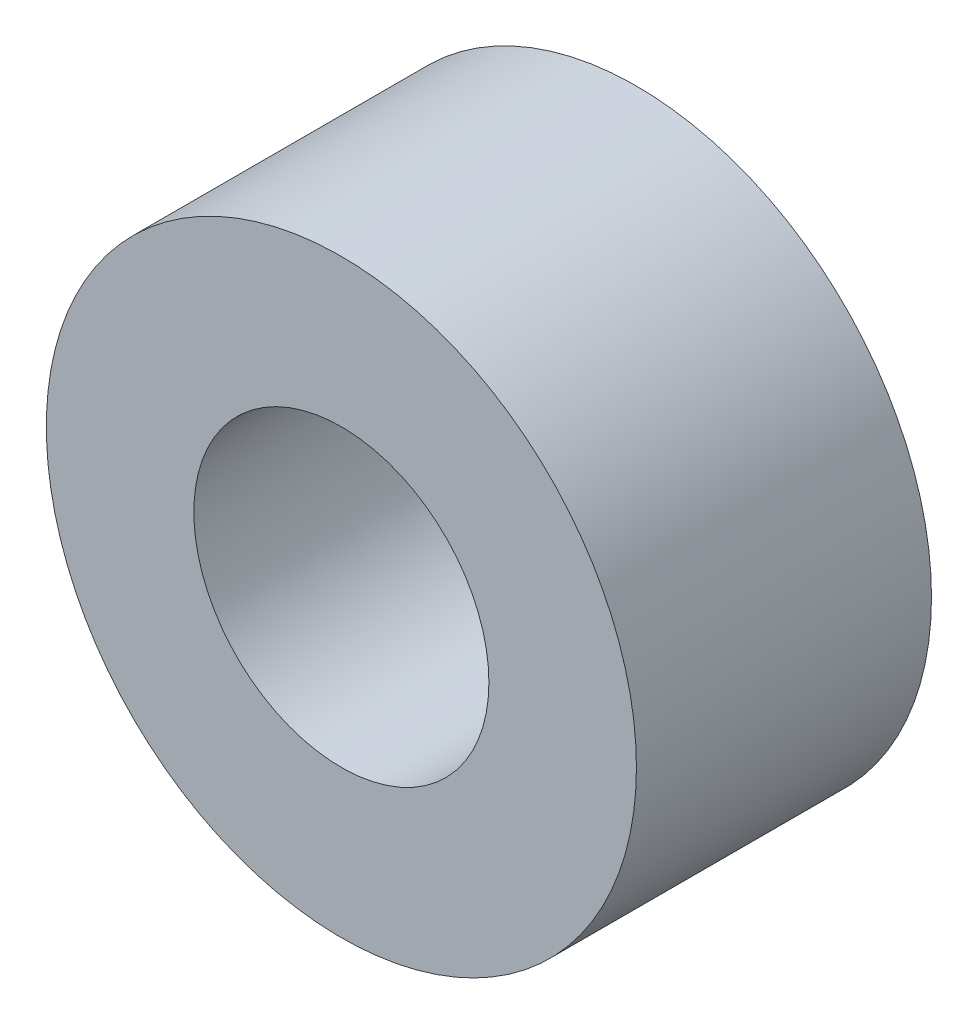
ISO-10303-21;
HEADER;
FILE_DESCRIPTION(('STEP AP214'),'2;1');
FILE_NAME('part.step','',(''),(''),'','','');
FILE_SCHEMA(('AUTOMOTIVE_DESIGN { 1 0 10303 214 1 1 1 1 }'));
ENDSEC;
DATA;
#1=APPLICATION_CONTEXT('core data for automotive mechanical design processes');
#2=APPLICATION_PROTOCOL_DEFINITION('international standard','automotive_design',2000,#1);
#3=PRODUCT_CONTEXT('',#1,'mechanical');
#4=PRODUCT('Part','Part','',(#3));
#5=PRODUCT_RELATED_PRODUCT_CATEGORY('part','',(#4));
#6=PRODUCT_DEFINITION_FORMATION('','',#4);
#7=PRODUCT_DEFINITION_CONTEXT('part definition',#1,'design');
#8=PRODUCT_DEFINITION('design','',#6,#7);
#9=PRODUCT_DEFINITION_SHAPE('','',#8);
#10=(LENGTH_UNIT() NAMED_UNIT(*) SI_UNIT(.MILLI.,.METRE.));
#11=(NAMED_UNIT(*) PLANE_ANGLE_UNIT() SI_UNIT($,.RADIAN.));
#12=(NAMED_UNIT(*) SI_UNIT($,.STERADIAN.) SOLID_ANGLE_UNIT());
#13=UNCERTAINTY_MEASURE_WITH_UNIT(LENGTH_MEASURE(1.E-05),#10,'distance_accuracy_value','');
#14=(GEOMETRIC_REPRESENTATION_CONTEXT(3) GLOBAL_UNCERTAINTY_ASSIGNED_CONTEXT((#13)) GLOBAL_UNIT_ASSIGNED_CONTEXT((#10,
#11,#12)) REPRESENTATION_CONTEXT('',''));
#15=CARTESIAN_POINT('',(0.,0.,0.));
#16=DIRECTION('',(0.,0.,1.));
#17=DIRECTION('',(1.,0.,0.));
#18=AXIS2_PLACEMENT_3D('',#15,#16,#17);
#19=CARTESIAN_POINT('',(0.,0.,10.));
#20=DIRECTION('',(0.,0.,1.));
#21=DIRECTION('',(1.,0.,0.));
#22=AXIS2_PLACEMENT_3D('',#19,#20,#21);
#23=PLANE('',#22);
#24=CARTESIAN_POINT('',(0.,0.,10.));
#25=DIRECTION('',(0.,0.,1.));
#26=DIRECTION('',(1.,0.,0.));
#27=AXIS2_PLACEMENT_3D('',#24,#25,#26);
#28=CIRCLE('',#27,10.);
#29=CARTESIAN_POINT('',(10.,0.,10.));
#30=VERTEX_POINT('',#29);
#31=EDGE_CURVE('E10',#30,#30,#28,.T.);
#32=ORIENTED_EDGE('',*,*,#31,.T.);
#33=EDGE_LOOP('',(#32));
#34=FACE_BOUND('',#33,.T.);
#35=CARTESIAN_POINT('',(0.,0.,10.));
#36=DIRECTION('',(0.,0.,1.));
#37=DIRECTION('',(1.,0.,0.));
#38=AXIS2_PLACEMENT_3D('',#35,#36,#37);
#39=CIRCLE('',#38,5.);
#40=CARTESIAN_POINT('',(5.,0.,10.));
#41=VERTEX_POINT('',#40);
#42=EDGE_CURVE('E42',#41,#41,#39,.T.);
#43=ORIENTED_EDGE('',*,*,#42,.F.);
#44=EDGE_LOOP('',(#43));
#45=FACE_BOUND('',#44,.T.);
#46=ADVANCED_FACE('F31',(#34,#45),#23,.T.);
#47=CARTESIAN_POINT('',(0.,0.,0.));
#48=DIRECTION('',(0.,0.,1.));
#49=DIRECTION('',(1.,0.,0.));
#50=AXIS2_PLACEMENT_3D('',#47,#48,#49);
#51=PLANE('',#50);
#52=CARTESIAN_POINT('',(0.,0.,0.));
#53=DIRECTION('',(0.,0.,1.));
#54=DIRECTION('',(1.,0.,0.));
#55=AXIS2_PLACEMENT_3D('',#52,#53,#54);
#56=CIRCLE('',#55,10.);
#57=CARTESIAN_POINT('',(10.,0.,0.));
#58=VERTEX_POINT('',#57);
#59=EDGE_CURVE('E35',#58,#58,#56,.T.);
#60=ORIENTED_EDGE('',*,*,#59,.F.);
#61=EDGE_LOOP('',(#60));
#62=FACE_BOUND('',#61,.T.);
#63=CARTESIAN_POINT('',(0.,0.,0.));
#64=DIRECTION('',(0.,0.,1.));
#65=DIRECTION('',(1.,0.,0.));
#66=AXIS2_PLACEMENT_3D('',#63,#64,#65);
#67=CIRCLE('',#66,5.);
#68=CARTESIAN_POINT('',(5.,0.,0.));
#69=VERTEX_POINT('',#68);
#70=EDGE_CURVE('E44',#69,#69,#67,.T.);
#71=ORIENTED_EDGE('',*,*,#70,.T.);
#72=EDGE_LOOP('',(#71));
#73=FACE_BOUND('',#72,.T.);
#74=ADVANCED_FACE('F54',(#62,#73),#51,.F.);
#75=CARTESIAN_POINT('',(0.,0.,10.));
#76=DIRECTION('',(0.,0.,-1.));
#77=DIRECTION('',(-1.,0.,0.));
#78=AXIS2_PLACEMENT_3D('',#75,#76,#77);
#79=CYLINDRICAL_SURFACE('',#78,10.);
#80=ORIENTED_EDGE('',*,*,#31,.F.);
#81=EDGE_LOOP('',(#80));
#82=FACE_BOUND('',#81,.T.);
#83=ORIENTED_EDGE('',*,*,#59,.T.);
#84=EDGE_LOOP('',(#83));
#85=FACE_BOUND('',#84,.T.);
#86=ADVANCED_FACE('F33',(#82,#85),#79,.T.);
#87=CARTESIAN_POINT('',(0.,0.,10.));
#88=DIRECTION('',(0.,0.,-1.));
#89=DIRECTION('',(-1.,0.,0.));
#90=AXIS2_PLACEMENT_3D('',#87,#88,#89);
#91=CYLINDRICAL_SURFACE('',#90,5.);
#92=ORIENTED_EDGE('',*,*,#42,.T.);
#93=EDGE_LOOP('',(#92));
#94=FACE_BOUND('',#93,.T.);
#95=ORIENTED_EDGE('',*,*,#70,.F.);
#96=EDGE_LOOP('',(#95));
#97=FACE_BOUND('',#96,.T.);
#98=ADVANCED_FACE('F50',(#94,#97),#91,.F.);
#99=CLOSED_SHELL('',(#46,#74,#86,#98));
#100=MANIFOLD_SOLID_BREP('B2',#99);
#101=ADVANCED_BREP_SHAPE_REPRESENTATION('',(#18,#100),#14);
#102=SHAPE_DEFINITION_REPRESENTATION(#9,#101);
ENDSEC;
END-ISO-10303-21;
